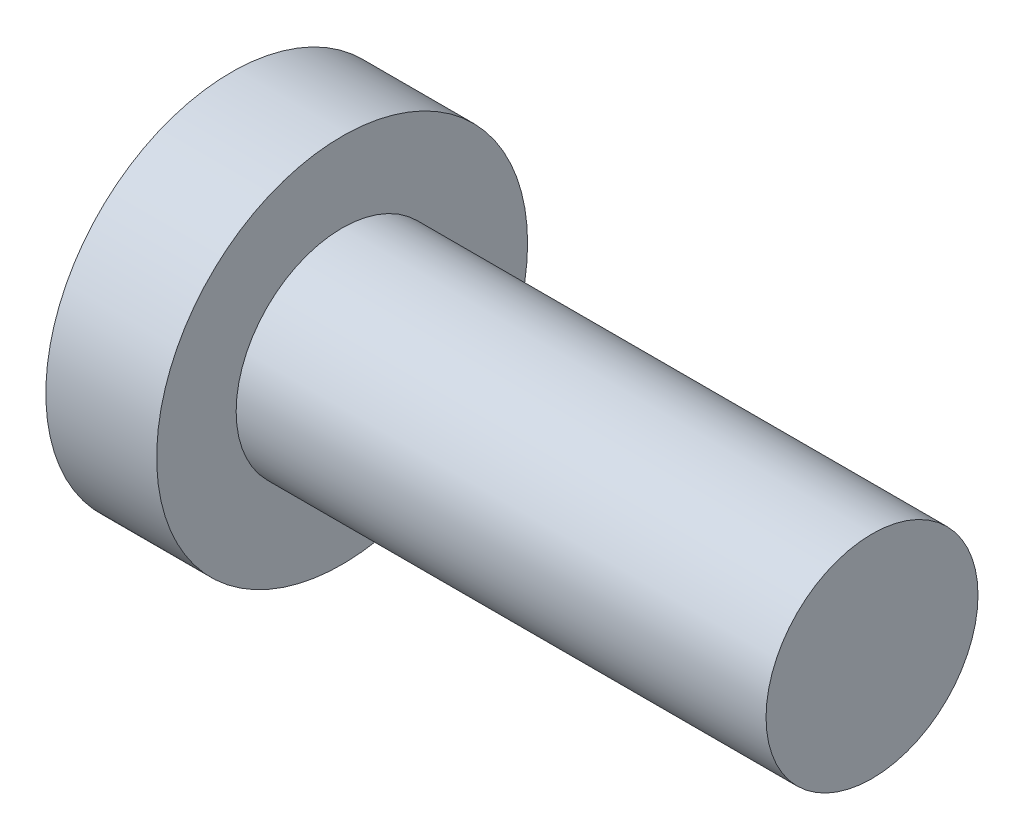
ISO-10303-21;
HEADER;
FILE_DESCRIPTION(('STEP AP214'),'2;1');
FILE_NAME('part.step','',(''),(''),'','','');
FILE_SCHEMA(('AUTOMOTIVE_DESIGN { 1 0 10303 214 1 1 1 1 }'));
ENDSEC;
DATA;
#1=APPLICATION_CONTEXT('core data for automotive mechanical design processes');
#2=APPLICATION_PROTOCOL_DEFINITION('international standard','automotive_design',2000,#1);
#3=PRODUCT_CONTEXT('',#1,'mechanical');
#4=PRODUCT('Part','Part','',(#3));
#5=PRODUCT_RELATED_PRODUCT_CATEGORY('part','',(#4));
#6=PRODUCT_DEFINITION_FORMATION('','',#4);
#7=PRODUCT_DEFINITION_CONTEXT('part definition',#1,'design');
#8=PRODUCT_DEFINITION('design','',#6,#7);
#9=PRODUCT_DEFINITION_SHAPE('','',#8);
#10=(LENGTH_UNIT() NAMED_UNIT(*) SI_UNIT(.MILLI.,.METRE.));
#11=(NAMED_UNIT(*) PLANE_ANGLE_UNIT() SI_UNIT($,.RADIAN.));
#12=(NAMED_UNIT(*) SI_UNIT($,.STERADIAN.) SOLID_ANGLE_UNIT());
#13=UNCERTAINTY_MEASURE_WITH_UNIT(LENGTH_MEASURE(1.E-05),#10,'distance_accuracy_value','');
#14=(GEOMETRIC_REPRESENTATION_CONTEXT(3) GLOBAL_UNCERTAINTY_ASSIGNED_CONTEXT((#13)) GLOBAL_UNIT_ASSIGNED_CONTEXT((#10,
#11,#12)) REPRESENTATION_CONTEXT('',''));
#15=CARTESIAN_POINT('',(0.,0.,0.));
#16=DIRECTION('',(0.,0.,1.));
#17=DIRECTION('',(1.,0.,0.));
#18=AXIS2_PLACEMENT_3D('',#15,#16,#17);
#19=CARTESIAN_POINT('',(1.01,0.22,0.22));
#20=DIRECTION('',(1.,0.,0.));
#21=DIRECTION('',(0.,0.,-1.));
#22=AXIS2_PLACEMENT_3D('',#19,#20,#21);
#23=PLANE('',#22);
#24=CARTESIAN_POINT('',(1.01,0.52,0.52));
#25=DIRECTION('',(-1.,0.,0.));
#26=DIRECTION('',(0.,0.,1.));
#27=AXIS2_PLACEMENT_3D('',#24,#25,#26);
#28=CIRCLE('',#27,0.3);
#29=CARTESIAN_POINT('',(1.01,0.516876228118476,0.220016263692126));
#30=VERTEX_POINT('',#29);
#31=CARTESIAN_POINT('',(1.01,0.220016263692126,0.516876228118476));
#32=VERTEX_POINT('',#31);
#33=EDGE_CURVE('E21',#30,#32,#28,.T.);
#34=ORIENTED_EDGE('',*,*,#33,.F.);
#35=DIRECTION('',(0.,0.,1.));
#36=VECTOR('',#35,1.);
#37=CARTESIAN_POINT('',(1.01,0.516876228118476,0.));
#38=LINE('',#37,#36);
#39=CARTESIAN_POINT('',(1.01,0.516876228118476,-0.220016263692126));
#40=VERTEX_POINT('',#39);
#41=EDGE_CURVE('E140',#40,#30,#38,.T.);
#42=ORIENTED_EDGE('',*,*,#41,.F.);
#43=CARTESIAN_POINT('',(1.01,0.52,-0.52));
#44=DIRECTION('',(-1.,0.,0.));
#45=DIRECTION('',(0.,0.,1.));
#46=AXIS2_PLACEMENT_3D('',#43,#44,#45);
#47=CIRCLE('',#46,0.3);
#48=CARTESIAN_POINT('',(1.01,0.220016263692126,-0.516876228118477));
#49=VERTEX_POINT('',#48);
#50=EDGE_CURVE('E221',#49,#40,#47,.T.);
#51=ORIENTED_EDGE('',*,*,#50,.F.);
#52=DIRECTION('',(0.,1.,0.));
#53=VECTOR('',#52,1.);
#54=CARTESIAN_POINT('',(1.01,0.,-0.516876228118477));
#55=LINE('',#54,#53);
#56=CARTESIAN_POINT('',(1.01,-0.220016263692126,-0.516876228118477));
#57=VERTEX_POINT('',#56);
#58=EDGE_CURVE('E161',#57,#49,#55,.T.);
#59=ORIENTED_EDGE('',*,*,#58,.F.);
#60=CARTESIAN_POINT('',(1.01,-0.52,-0.52));
#61=DIRECTION('',(-1.,0.,0.));
#62=DIRECTION('',(0.,0.,1.));
#63=AXIS2_PLACEMENT_3D('',#60,#61,#62);
#64=CIRCLE('',#63,0.3);
#65=CARTESIAN_POINT('',(1.01,-0.516876228118476,-0.220016263692126));
#66=VERTEX_POINT('',#65);
#67=EDGE_CURVE('E244',#66,#57,#64,.T.);
#68=ORIENTED_EDGE('',*,*,#67,.F.);
#69=DIRECTION('',(0.,0.,1.));
#70=VECTOR('',#69,1.);
#71=CARTESIAN_POINT('',(1.01,-0.516876228118476,0.));
#72=LINE('',#71,#70);
#73=CARTESIAN_POINT('',(1.01,-0.516876228118476,0.220016263692125));
#74=VERTEX_POINT('',#73);
#75=EDGE_CURVE('E250',#74,#66,#72,.F.);
#76=ORIENTED_EDGE('',*,*,#75,.F.);
#77=CARTESIAN_POINT('',(1.01,-0.52,0.52));
#78=DIRECTION('',(-1.,0.,0.));
#79=DIRECTION('',(0.,0.,1.));
#80=AXIS2_PLACEMENT_3D('',#77,#78,#79);
#81=CIRCLE('',#80,0.3);
#82=CARTESIAN_POINT('',(1.01,-0.220016263692126,0.516876228118476));
#83=VERTEX_POINT('',#82);
#84=EDGE_CURVE('E268',#83,#74,#81,.T.);
#85=ORIENTED_EDGE('',*,*,#84,.F.);
#86=DIRECTION('',(0.,1.,0.));
#87=VECTOR('',#86,1.);
#88=CARTESIAN_POINT('',(1.01,0.,0.516876228118476));
#89=LINE('',#88,#87);
#90=EDGE_CURVE('E274',#32,#83,#89,.F.);
#91=ORIENTED_EDGE('',*,*,#90,.F.);
#92=EDGE_LOOP('',(#34,#42,#51,#59,#68,#76,#85,#91));
#93=FACE_BOUND('',#92,.T.);
#94=ADVANCED_FACE('F18',(#93),#23,.F.);
#95=CARTESIAN_POINT('',(1.01,0.22,0.22));
#96=DIRECTION('',(0.,0.,-1.));
#97=DIRECTION('',(0.,1.,0.));
#98=AXIS2_PLACEMENT_3D('',#95,#96,#97);
#99=PLANE('',#98);
#100=DIRECTION('',(-1.,0.,0.));
#101=VECTOR('',#100,1.);
#102=CARTESIAN_POINT('',(1.01,0.52,0.22));
#103=LINE('',#102,#101);
#104=CARTESIAN_POINT('',(0.0355627454291621,0.52,0.22));
#105=VERTEX_POINT('',#104);
#106=CARTESIAN_POINT('',(1.00458946839209,0.519999999998763,0.220000000000004));
#107=VERTEX_POINT('',#106);
#108=EDGE_CURVE('E119',#105,#107,#103,.F.);
#109=ORIENTED_EDGE('',*,*,#108,.F.);
#110=CARTESIAN_POINT('',(0.124543344373249,1.02809486660112,0.22));
#111=CARTESIAN_POINT('',(0.104849922113076,0.944264082822282,0.22));
#112=CARTESIAN_POINT('',(0.087588161070983,0.860007452049439,0.22));
#113=CARTESIAN_POINT('',(0.0579279614229541,0.690642496515734,0.22));
#114=CARTESIAN_POINT('',(0.0455295228170185,0.605534171754872,0.22));
#115=CARTESIAN_POINT('',(0.0355627454291619,0.52,0.22));
#116=B_SPLINE_CURVE_WITH_KNOTS('',3,(#110,#111,#112,#113,#114,#115),.UNSPECIFIED.,.F.,.F.,(4,2,
4),(0.,0.258020026376229,0.516040052752457),.UNSPECIFIED.);
#117=CARTESIAN_POINT('',(0.124543344373167,1.02809486660077,0.22));
#118=VERTEX_POINT('',#117);
#119=EDGE_CURVE('E135',#118,#105,#116,.T.);
#120=ORIENTED_EDGE('',*,*,#119,.F.);
#121=DIRECTION('',(0.866025403784438,-0.500000000000001,0.));
#122=VECTOR('',#121,1.);
#123=CARTESIAN_POINT('',(0.,1.1,0.22));
#124=LINE('',#123,#122);
#125=EDGE_CURVE('E133',#107,#118,#124,.F.);
#126=ORIENTED_EDGE('',*,*,#125,.F.);
#127=EDGE_LOOP('',(#109,#120,#126));
#128=FACE_BOUND('',#127,.T.);
#129=ADVANCED_FACE('F134',(#128),#99,.T.);
#130=CARTESIAN_POINT('',(1.01,0.52,0.52));
#131=DIRECTION('',(-1.,0.,0.));
#132=DIRECTION('',(0.,0.,1.));
#133=AXIS2_PLACEMENT_3D('',#130,#131,#132);
#134=CYLINDRICAL_SURFACE('',#133,0.3);
#135=ORIENTED_EDGE('',*,*,#108,.T.);
#136=DIRECTION('',(-0.866022469392622,0.499998305828082,-0.00260320497714323));
#137=VECTOR('',#136,1.);
#138=CARTESIAN_POINT('',(1.01,0.516876228118476,0.220016263692126));
#139=LINE('',#138,#137);
#140=EDGE_CURVE('E123',#30,#107,#139,.T.);
#141=ORIENTED_EDGE('',*,*,#140,.F.);
#142=ORIENTED_EDGE('',*,*,#33,.T.);
#143=DIRECTION('',(0.866022469392615,0.00260320497712648,-0.499998305828094));
#144=VECTOR('',#143,1.);
#145=CARTESIAN_POINT('',(1.00458946838995,0.22,0.52));
#146=LINE('',#145,#144);
#147=CARTESIAN_POINT('',(1.00458946836315,0.219999999999939,0.520000000015471));
#148=VERTEX_POINT('',#147);
#149=EDGE_CURVE('E280',#148,#32,#146,.T.);
#150=ORIENTED_EDGE('',*,*,#149,.F.);
#151=DIRECTION('',(1.,0.,0.));
#152=VECTOR('',#151,1.);
#153=CARTESIAN_POINT('',(1.01,0.22,0.52));
#154=LINE('',#153,#152);
#155=CARTESIAN_POINT('',(0.0355627454291622,0.22,0.52));
#156=VERTEX_POINT('',#155);
#157=EDGE_CURVE('E130',#156,#148,#154,.T.);
#158=ORIENTED_EDGE('',*,*,#157,.F.);
#159=CARTESIAN_POINT('',(0.0355627454291619,0.52,0.22));
#160=CARTESIAN_POINT('',(0.0336144724237012,0.503287720511368,0.219985328370494));
#161=CARTESIAN_POINT('',(0.0318313107592915,0.486557176445317,0.221395774015768));
#162=CARTESIAN_POINT('',(0.0286392637046213,0.45353437167121,0.226980778799422));
#163=CARTESIAN_POINT('',(0.0272302228990259,0.437241931504151,0.231154187637122));
#164=CARTESIAN_POINT('',(0.0248278492627614,0.405543209834353,0.242183390271547));
#165=CARTESIAN_POINT('',(0.023834838749939,0.390137623358916,0.249041255913871));
#166=CARTESIAN_POINT('',(0.0222954705714954,0.36067866272415,0.265247055283416));
#167=CARTESIAN_POINT('',(0.0217489713274229,0.346624861192877,0.274594198470578));
#168=CARTESIAN_POINT('',(0.0211210003816236,0.320369345983066,0.295441236792413));
#169=CARTESIAN_POINT('',(0.0210362310499093,0.308155106097585,0.306925258793494));
#170=CARTESIAN_POINT('',(0.0213253868856954,0.285809210047338,0.331761685438082));
#171=CARTESIAN_POINT('',(0.0216993026507305,0.27567751119808,0.345114051777918));
#172=CARTESIAN_POINT('',(0.0228926461672017,0.257809524910824,0.373257872138579));
#173=CARTESIAN_POINT('',(0.0237107084031614,0.250066008909201,0.388044801778144));
#174=CARTESIAN_POINT('',(0.0257675907829931,0.237142871439603,0.418670011750901));
#175=CARTESIAN_POINT('',(0.0270062517189219,0.231962281655374,0.434507892448339));
#176=CARTESIAN_POINT('',(0.0294449242960518,0.225424263226575,0.462016435468613));
#177=CARTESIAN_POINT('',(0.0305487725472808,0.223390097819393,0.473539851773626));
#178=CARTESIAN_POINT('',(0.0329296678559742,0.220677851109225,0.496710667987145));
#179=CARTESIAN_POINT('',(0.0342064645840768,0.219997831719864,0.508357866680795));
#180=CARTESIAN_POINT('',(0.0355627454291623,0.22,0.52));
#181=B_SPLINE_CURVE_WITH_KNOTS('',3,(#159,#160,#161,#162,#163,#164,#165,#166,#167,#168,#169,
#170,#171,#172,#173,#174,#175,#176,#177,#178,#179,#180),.UNSPECIFIED.,.F.,.F.,(4,2,2,2,2,2,2,2,
2,2,4),(0.,0.0504152737466318,0.100809571359595,0.151242839880603,0.201660110959704,
0.251716830020686,0.301772522999282,0.351675185552514,0.401558979621452,0.436743606856448,
0.471877840708902),.UNSPECIFIED.);
#182=EDGE_CURVE('E126',#105,#156,#181,.T.);
#183=ORIENTED_EDGE('',*,*,#182,.F.);
#184=EDGE_LOOP('',(#135,#141,#142,#150,#158,#183));
#185=FACE_BOUND('',#184,.T.);
#186=ADVANCED_FACE('F121',(#185),#134,.T.);
#187=CARTESIAN_POINT('',(1.01,0.22,0.22));
#188=DIRECTION('',(0.,-1.,0.));
#189=DIRECTION('',(0.,0.,-1.));
#190=AXIS2_PLACEMENT_3D('',#187,#188,#189);
#191=PLANE('',#190);
#192=ORIENTED_EDGE('',*,*,#157,.T.);
#193=DIRECTION('',(-0.866025403784438,0.,0.500000000000001));
#194=VECTOR('',#193,1.);
#195=CARTESIAN_POINT('',(0.,0.22,1.1));
#196=LINE('',#195,#194);
#197=CARTESIAN_POINT('',(0.124543344373086,0.22,1.02809486660042));
#198=VERTEX_POINT('',#197);
#199=EDGE_CURVE('E277',#198,#148,#196,.F.);
#200=ORIENTED_EDGE('',*,*,#199,.F.);
#201=CARTESIAN_POINT('',(4.5,0.22,0.));
#202=DIRECTION('',(0.,1.,0.));
#203=DIRECTION('',(0.,0.,1.));
#204=AXIS2_PLACEMENT_3D('',#201,#202,#203);
#205=CIRCLE('',#204,4.49461900498808);
#206=EDGE_CURVE('E293',#156,#198,#205,.T.);
#207=ORIENTED_EDGE('',*,*,#206,.F.);
#208=EDGE_LOOP('',(#192,#200,#207));
#209=FACE_BOUND('',#208,.T.);
#210=ADVANCED_FACE('F290',(#209),#191,.T.);
#211=CARTESIAN_POINT('',(0.,0.,1.1));
#212=DIRECTION('',(-0.500000000000001,0.,-0.866025403784438));
#213=DIRECTION('',(-0.866025403784438,0.,0.500000000000001));
#214=AXIS2_PLACEMENT_3D('',#211,#212,#213);
#215=PLANE('',#214);
#216=DIRECTION('',(0.866025403784438,0.,-0.500000000000001));
#217=VECTOR('',#216,1.);
#218=CARTESIAN_POINT('',(0.124543344373086,-0.22,1.02809486660042));
#219=LINE('',#218,#217);
#220=CARTESIAN_POINT('',(0.124543344373086,-0.220000000000001,1.02809486660042));
#221=VERTEX_POINT('',#220);
#222=CARTESIAN_POINT('',(1.00458946838995,-0.22,0.52));
#223=VERTEX_POINT('',#222);
#224=EDGE_CURVE('E271',#221,#223,#219,.T.);
#225=ORIENTED_EDGE('',*,*,#224,.F.);
#226=CARTESIAN_POINT('',(0.124543344373086,0.22,1.02809486660042));
#227=CARTESIAN_POINT('',(0.121298684225372,0.146666666666667,1.02996817201013));
#228=CARTESIAN_POINT('',(0.119676354151515,0.0733333333333333,1.03090482471499));
#229=CARTESIAN_POINT('',(0.119676354151515,-0.0733333333333337,1.03090482471499));
#230=CARTESIAN_POINT('',(0.121298684225372,-0.146666666666667,1.02996817201013));
#231=CARTESIAN_POINT('',(0.124543344373086,-0.220000000000001,1.02809486660042));
#232=B_SPLINE_CURVE_WITH_KNOTS('',3,(#226,#227,#228,#229,#230,#231),.UNSPECIFIED.,.F.,.F.,(4,2,
4),(0.,0.220071768881024,0.440143537762047),.UNSPECIFIED.);
#233=EDGE_CURVE('E300',#198,#221,#232,.T.);
#234=ORIENTED_EDGE('',*,*,#233,.F.);
#235=ORIENTED_EDGE('',*,*,#199,.T.);
#236=ORIENTED_EDGE('',*,*,#149,.T.);
#237=ORIENTED_EDGE('',*,*,#90,.T.);
#238=CARTESIAN_POINT('',(1.00458946838995,-0.22,0.52));
#239=CARTESIAN_POINT('',(1.00481490720703,-0.219999999999949,0.519869840486178));
#240=CARTESIAN_POINT('',(1.00504034602412,-0.220000084707494,0.519739680972357));
#241=CARTESIAN_POINT('',(1.00549122365829,-0.220000423537406,0.519479362165225));
#242=CARTESIAN_POINT('',(1.00571666247537,-0.220000677659774,0.519349202871913));
#243=CARTESIAN_POINT('',(1.00616754010955,-0.220001355318963,0.519088884726309));
#244=CARTESIAN_POINT('',(1.00639297892663,-0.220001778855784,0.518958725874017));
#245=CARTESIAN_POINT('',(1.0068438565608,-0.220002795343145,0.51869840883096));
#246=CARTESIAN_POINT('',(1.00706929537789,-0.220003388293685,0.518568250640195));
#247=CARTESIAN_POINT('',(1.00752017301206,-0.220004743607485,0.5183079351407));
#248=CARTESIAN_POINT('',(1.00774561182914,-0.220005505970745,0.51817777783197));
#249=CARTESIAN_POINT('',(1.00819648946332,-0.220007200108688,0.517917464317052));
#250=CARTESIAN_POINT('',(1.0084219282804,-0.220008131883371,0.517787308110863));
#251=CARTESIAN_POINT('',(1.00887280591457,-0.220010164842598,0.517526997021531));
#252=CARTESIAN_POINT('',(1.00909824473166,-0.220011266027142,0.517396842138387));
#253=CARTESIAN_POINT('',(1.00954912236583,-0.220013637804165,0.517136533915647));
#254=CARTESIAN_POINT('',(1.00977456118291,-0.220014908396643,0.517006380576049));
#255=CARTESIAN_POINT('',(1.01,-0.220016263692126,0.516876228118476));
#256=B_SPLINE_CURVE_WITH_KNOTS('',3,(#238,#239,#240,#241,#242,#243,#244,#245,#246,#247,#248,
#249,#250,#251,#252,#253,#254,#255),.UNSPECIFIED.,.F.,.F.,(4,2,2,2,2,2,2,2,4),(0.,
0.00078094648475928,0.00156189296951852,0.00234283945427775,0.003123785939037,
0.00390473242379628,0.0046856789085555,0.00546662539331475,0.00624757187807402),.UNSPECIFIED.);
#257=EDGE_CURVE('E262',#223,#83,#256,.T.);
#258=ORIENTED_EDGE('',*,*,#257,.F.);
#259=EDGE_LOOP('',(#225,#234,#235,#236,#237,#258));
#260=FACE_BOUND('',#259,.T.);
#261=ADVANCED_FACE('F298',(#260),#215,.T.);
#262=CARTESIAN_POINT('',(1.01,-0.22,0.22));
#263=DIRECTION('',(0.,1.,0.));
#264=DIRECTION('',(0.,0.,1.));
#265=AXIS2_PLACEMENT_3D('',#262,#263,#264);
#266=PLANE('',#265);
#267=DIRECTION('',(-1.,0.,0.));
#268=VECTOR('',#267,1.);
#269=CARTESIAN_POINT('',(1.01,-0.22,0.52));
#270=LINE('',#269,#268);
#271=CARTESIAN_POINT('',(0.0355627454291623,-0.220000000000001,0.52));
#272=VERTEX_POINT('',#271);
#273=EDGE_CURVE('E265',#272,#223,#270,.F.);
#274=ORIENTED_EDGE('',*,*,#273,.F.);
#275=CARTESIAN_POINT('',(4.5,-0.220000000000001,0.));
#276=DIRECTION('',(0.,1.,0.));
#277=DIRECTION('',(0.,0.,1.));
#278=AXIS2_PLACEMENT_3D('',#275,#276,#277);
#279=CIRCLE('',#278,4.49461900498808);
#280=EDGE_CURVE('E304',#221,#272,#279,.F.);
#281=ORIENTED_EDGE('',*,*,#280,.F.);
#282=ORIENTED_EDGE('',*,*,#224,.T.);
#283=EDGE_LOOP('',(#274,#281,#282));
#284=FACE_BOUND('',#283,.T.);
#285=ADVANCED_FACE('F413',(#284),#266,.T.);
#286=CARTESIAN_POINT('',(1.01,-0.52,0.52));
#287=DIRECTION('',(-1.,0.,0.));
#288=DIRECTION('',(0.,0.,1.));
#289=AXIS2_PLACEMENT_3D('',#286,#287,#288);
#290=CYLINDRICAL_SURFACE('',#289,0.3);
#291=ORIENTED_EDGE('',*,*,#273,.T.);
#292=ORIENTED_EDGE('',*,*,#257,.T.);
#293=ORIENTED_EDGE('',*,*,#84,.T.);
#294=DIRECTION('',(0.866022469392616,0.499998305828093,0.00260320497712575));
#295=VECTOR('',#294,1.);
#296=CARTESIAN_POINT('',(1.00458946838994,-0.52,0.22));
#297=LINE('',#296,#295);
#298=CARTESIAN_POINT('',(1.00458946836352,-0.520000000015254,0.21999999999994));
#299=VERTEX_POINT('',#298);
#300=EDGE_CURVE('E256',#299,#74,#297,.T.);
#301=ORIENTED_EDGE('',*,*,#300,.F.);
#302=DIRECTION('',(1.,0.,0.));
#303=VECTOR('',#302,1.);
#304=CARTESIAN_POINT('',(1.01,-0.52,0.22));
#305=LINE('',#304,#303);
#306=CARTESIAN_POINT('',(0.0355627454291621,-0.52,0.22));
#307=VERTEX_POINT('',#306);
#308=EDGE_CURVE('E257',#307,#299,#305,.T.);
#309=ORIENTED_EDGE('',*,*,#308,.F.);
#310=CARTESIAN_POINT('',(0.0355627454291623,-0.220000000000001,0.52));
#311=CARTESIAN_POINT('',(0.0336144724237012,-0.219985328370494,0.503287720511368));
#312=CARTESIAN_POINT('',(0.0318313107592915,-0.221395774015768,0.486557176445317));
#313=CARTESIAN_POINT('',(0.0286392637046214,-0.226980778799423,0.453534371671211));
#314=CARTESIAN_POINT('',(0.0272302228990262,-0.231154187637122,0.437241931504153));
#315=CARTESIAN_POINT('',(0.0248278492627622,-0.242183390271547,0.405543209834355));
#316=CARTESIAN_POINT('',(0.0238348387499401,-0.249041255913871,0.390137623358918));
#317=CARTESIAN_POINT('',(0.022295470571496,-0.265247055283415,0.360678662724152));
#318=CARTESIAN_POINT('',(0.0217489713274227,-0.274594198470577,0.346624861192879));
#319=CARTESIAN_POINT('',(0.0211210003816225,-0.295441236792411,0.320369345983068));
#320=CARTESIAN_POINT('',(0.0210362310499081,-0.306925258793492,0.308155106097588));
#321=CARTESIAN_POINT('',(0.0213253868856949,-0.33176168543808,0.28580921004734));
#322=CARTESIAN_POINT('',(0.0216993026507309,-0.345114051777916,0.275677511198083));
#323=CARTESIAN_POINT('',(0.022892646167202,-0.373257872138576,0.257809524910826));
#324=CARTESIAN_POINT('',(0.0237107084031607,-0.388044801778141,0.250066008909202));
#325=CARTESIAN_POINT('',(0.025767590782992,-0.418670011750899,0.237142871439604));
#326=CARTESIAN_POINT('',(0.0270062517189215,-0.434507892448336,0.231962281655375));
#327=CARTESIAN_POINT('',(0.0294449242960514,-0.462016435468611,0.225424263226576));
#328=CARTESIAN_POINT('',(0.0305487725472801,-0.473539851773625,0.223390097819393));
#329=CARTESIAN_POINT('',(0.0329296678559732,-0.496710667987144,0.220677851109225));
#330=CARTESIAN_POINT('',(0.0342064645840757,-0.508357866680795,0.219997831719863));
#331=CARTESIAN_POINT('',(0.0355627454291619,-0.52,0.22));
#332=B_SPLINE_CURVE_WITH_KNOTS('',3,(#310,#311,#312,#313,#314,#315,#316,#317,#318,#319,#320,
#321,#322,#323,#324,#325,#326,#327,#328,#329,#330,#331),.UNSPECIFIED.,.F.,.F.,(4,2,2,2,2,2,2,2,
2,2,4),(0.,0.0504152737466306,0.100809571359593,0.1512428398806,0.2016601109597,
0.251716830020682,0.301772522999278,0.35167518555251,0.401558979621449,0.436743606856446,
0.471877840708902),.UNSPECIFIED.);
#333=EDGE_CURVE('E418',#272,#307,#332,.T.);
#334=ORIENTED_EDGE('',*,*,#333,.F.);
#335=EDGE_LOOP('',(#291,#292,#293,#301,#309,#334));
#336=FACE_BOUND('',#335,.T.);
#337=ADVANCED_FACE('F384',(#336),#290,.T.);
#338=CARTESIAN_POINT('',(1.01,-0.22,0.22));
#339=DIRECTION('',(0.,0.,-1.));
#340=DIRECTION('',(0.,1.,0.));
#341=AXIS2_PLACEMENT_3D('',#338,#339,#340);
#342=PLANE('',#341);
#343=ORIENTED_EDGE('',*,*,#308,.T.);
#344=DIRECTION('',(-0.866025403784438,-0.500000000000001,0.));
#345=VECTOR('',#344,1.);
#346=CARTESIAN_POINT('',(0.,-1.1,0.22));
#347=LINE('',#346,#345);
#348=CARTESIAN_POINT('',(0.124543344363401,-1.02809486660601,0.219999999781252));
#349=VERTEX_POINT('',#348);
#350=EDGE_CURVE('E253',#349,#299,#347,.F.);
#351=ORIENTED_EDGE('',*,*,#350,.F.);
#352=CARTESIAN_POINT('',(0.0355627454291619,-0.52,0.22));
#353=CARTESIAN_POINT('',(0.0455295228170186,-0.605534171754872,0.22));
#354=CARTESIAN_POINT('',(0.0579279614229541,-0.690642496515734,0.22));
#355=CARTESIAN_POINT('',(0.087588161070983,-0.860007452049439,0.22));
#356=CARTESIAN_POINT('',(0.104849922113076,-0.944264082822282,0.22));
#357=CARTESIAN_POINT('',(0.124543344373249,-1.02809486660112,0.22));
#358=B_SPLINE_CURVE_WITH_KNOTS('',3,(#352,#353,#354,#355,#356,#357),.UNSPECIFIED.,.F.,.F.,(4,2,
4),(0.,0.258020026376229,0.516040052752458),.UNSPECIFIED.);
#359=EDGE_CURVE('E425',#307,#349,#358,.T.);
#360=ORIENTED_EDGE('',*,*,#359,.F.);
#361=EDGE_LOOP('',(#343,#351,#360));
#362=FACE_BOUND('',#361,.T.);
#363=ADVANCED_FACE('F412',(#362),#342,.T.);
#364=CARTESIAN_POINT('',(0.,-1.1,0.));
#365=DIRECTION('',(-0.500000000000001,0.866025403784438,0.));
#366=DIRECTION('',(-0.866025403784438,-0.500000000000001,0.));
#367=AXIS2_PLACEMENT_3D('',#364,#365,#366);
#368=PLANE('',#367);
#369=CARTESIAN_POINT('',(0.124543344353716,-1.02809486661161,0.219999999562505));
#370=CARTESIAN_POINT('',(0.121298684218916,-1.02996817201386,0.146666666375003));
#371=CARTESIAN_POINT('',(0.119676354151515,-1.03090482471499,0.0733333331875016));
#372=CARTESIAN_POINT('',(0.119676354151515,-1.03090482471499,-0.0733333331875025));
#373=CARTESIAN_POINT('',(0.121298684218916,-1.02996817201386,-0.146666666375005));
#374=CARTESIAN_POINT('',(0.124543344353717,-1.02809486661161,-0.219999999562508));
#375=B_SPLINE_CURVE_WITH_KNOTS('',3,(#369,#370,#371,#372,#373,#374),.UNSPECIFIED.,.F.,.F.,(4,2,
4),(0.,0.220071768443099,0.440143536886202),.UNSPECIFIED.);
#376=CARTESIAN_POINT('',(0.124543344373167,-1.02809486660077,-0.220000000000002));
#377=VERTEX_POINT('',#376);
#378=EDGE_CURVE('E436',#349,#377,#375,.T.);
#379=ORIENTED_EDGE('',*,*,#378,.F.);
#380=ORIENTED_EDGE('',*,*,#350,.T.);
#381=ORIENTED_EDGE('',*,*,#300,.T.);
#382=ORIENTED_EDGE('',*,*,#75,.T.);
#383=CARTESIAN_POINT('',(1.00458946838995,-0.52,-0.22));
#384=CARTESIAN_POINT('',(1.00481490720703,-0.519869840486179,-0.219999999999949));
#385=CARTESIAN_POINT('',(1.00504034602412,-0.519739680972358,-0.220000084707494));
#386=CARTESIAN_POINT('',(1.00549122365829,-0.519479362165225,-0.220000423537406));
#387=CARTESIAN_POINT('',(1.00571666247537,-0.519349202871914,-0.220000677659774));
#388=CARTESIAN_POINT('',(1.00616754010954,-0.519088884726309,-0.220001355318963));
#389=CARTESIAN_POINT('',(1.00639297892663,-0.518958725874017,-0.220001778855784));
#390=CARTESIAN_POINT('',(1.0068438565608,-0.51869840883096,-0.220002795343145));
#391=CARTESIAN_POINT('',(1.00706929537789,-0.518568250640195,-0.220003388293685));
#392=CARTESIAN_POINT('',(1.00752017301206,-0.5183079351407,-0.220004743607485));
#393=CARTESIAN_POINT('',(1.00774561182914,-0.51817777783197,-0.220005505970745));
#394=CARTESIAN_POINT('',(1.00819648946332,-0.517917464317052,-0.220007200108688));
#395=CARTESIAN_POINT('',(1.0084219282804,-0.517787308110863,-0.220008131883371));
#396=CARTESIAN_POINT('',(1.00887280591457,-0.51752699702153,-0.220010164842598));
#397=CARTESIAN_POINT('',(1.00909824473166,-0.517396842138387,-0.220011266027142));
#398=CARTESIAN_POINT('',(1.00954912236583,-0.517136533915646,-0.220013637804165));
#399=CARTESIAN_POINT('',(1.00977456118291,-0.517006380576049,-0.220014908396643));
#400=CARTESIAN_POINT('',(1.01,-0.516876228118476,-0.220016263692126));
#401=B_SPLINE_CURVE_WITH_KNOTS('',3,(#383,#384,#385,#386,#387,#388,#389,#390,#391,#392,#393,
#394,#395,#396,#397,#398,#399,#400),.UNSPECIFIED.,.F.,.F.,(4,2,2,2,2,2,2,2,4),(0.,
0.000780946484759468,0.001561892969519,0.00234283945427829,0.00312378593903779,
0.00390473242379724,0.00468567890855653,0.00546662539331601,0.00624757187807553),.UNSPECIFIED.);
#402=CARTESIAN_POINT('',(1.00458946838995,-0.52,-0.22));
#403=VERTEX_POINT('',#402);
#404=EDGE_CURVE('E238',#403,#66,#401,.T.);
#405=ORIENTED_EDGE('',*,*,#404,.F.);
#406=DIRECTION('',(0.866025403784438,0.500000000000001,0.));
#407=VECTOR('',#406,1.);
#408=CARTESIAN_POINT('',(0.124543344373086,-1.02809486660042,-0.22));
#409=LINE('',#408,#407);
#410=EDGE_CURVE('E247',#377,#403,#409,.T.);
#411=ORIENTED_EDGE('',*,*,#410,.F.);
#412=EDGE_LOOP('',(#379,#380,#381,#382,#405,#411));
#413=FACE_BOUND('',#412,.T.);
#414=ADVANCED_FACE('F391',(#413),#368,.T.);
#415=CARTESIAN_POINT('',(1.01,-0.22,-0.22));
#416=DIRECTION('',(0.,0.,1.));
#417=DIRECTION('',(0.,-1.,0.));
#418=AXIS2_PLACEMENT_3D('',#415,#416,#417);
#419=PLANE('',#418);
#420=DIRECTION('',(-1.,0.,0.));
#421=VECTOR('',#420,1.);
#422=CARTESIAN_POINT('',(1.01,-0.52,-0.22));
#423=LINE('',#422,#421);
#424=CARTESIAN_POINT('',(0.0355627454291621,-0.52,-0.219999999999999));
#425=VERTEX_POINT('',#424);
#426=EDGE_CURVE('E241',#425,#403,#423,.F.);
#427=ORIENTED_EDGE('',*,*,#426,.F.);
#428=CARTESIAN_POINT('',(0.124543344373249,-1.02809486660112,-0.220000000000003));
#429=CARTESIAN_POINT('',(0.104849922113076,-0.944264082822282,-0.220000000000002));
#430=CARTESIAN_POINT('',(0.087588161070983,-0.860007452049439,-0.220000000000001));
#431=CARTESIAN_POINT('',(0.0579279614229541,-0.690642496515734,-0.219999999999999));
#432=CARTESIAN_POINT('',(0.0455295228170186,-0.605534171754872,-0.219999999999999));
#433=CARTESIAN_POINT('',(0.0355627454291619,-0.52,-0.219999999999998));
#434=B_SPLINE_CURVE_WITH_KNOTS('',3,(#428,#429,#430,#431,#432,#433),.UNSPECIFIED.,.F.,.F.,(4,2,
4),(0.,0.258020026376229,0.516040052752458),.UNSPECIFIED.);
#435=EDGE_CURVE('E437',#377,#425,#434,.T.);
#436=ORIENTED_EDGE('',*,*,#435,.F.);
#437=ORIENTED_EDGE('',*,*,#410,.T.);
#438=EDGE_LOOP('',(#427,#436,#437));
#439=FACE_BOUND('',#438,.T.);
#440=ADVANCED_FACE('F453',(#439),#419,.T.);
#441=CARTESIAN_POINT('',(1.01,-0.52,-0.52));
#442=DIRECTION('',(-1.,0.,0.));
#443=DIRECTION('',(0.,0.,1.));
#444=AXIS2_PLACEMENT_3D('',#441,#442,#443);
#445=CYLINDRICAL_SURFACE('',#444,0.3);
#446=ORIENTED_EDGE('',*,*,#426,.T.);
#447=ORIENTED_EDGE('',*,*,#404,.T.);
#448=ORIENTED_EDGE('',*,*,#67,.T.);
#449=DIRECTION('',(0.866022469392615,-0.0026032049771395,0.499998305828094));
#450=VECTOR('',#449,1.);
#451=CARTESIAN_POINT('',(1.00458946838995,-0.22,-0.52));
#452=LINE('',#451,#450);
#453=CARTESIAN_POINT('',(1.00458946835645,-0.219999999999925,-0.520000000019338));
#454=VERTEX_POINT('',#453);
#455=EDGE_CURVE('E232',#454,#57,#452,.T.);
#456=ORIENTED_EDGE('',*,*,#455,.F.);
#457=DIRECTION('',(1.,0.,0.));
#458=VECTOR('',#457,1.);
#459=CARTESIAN_POINT('',(1.01,-0.22,-0.52));
#460=LINE('',#459,#458);
#461=CARTESIAN_POINT('',(0.0355627454291622,-0.22,-0.52));
#462=VERTEX_POINT('',#461);
#463=EDGE_CURVE('E233',#462,#454,#460,.T.);
#464=ORIENTED_EDGE('',*,*,#463,.F.);
#465=CARTESIAN_POINT('',(0.0355627454291619,-0.52,-0.219999999999998));
#466=CARTESIAN_POINT('',(0.0336144724237011,-0.503287720511368,-0.219985328370493));
#467=CARTESIAN_POINT('',(0.0318313107592914,-0.486557176445317,-0.221395774015768));
#468=CARTESIAN_POINT('',(0.0286392637046214,-0.453534371671211,-0.226980778799423));
#469=CARTESIAN_POINT('',(0.0272302228990262,-0.437241931504152,-0.231154187637122));
#470=CARTESIAN_POINT('',(0.0248278492627621,-0.405543209834354,-0.242183390271547));
#471=CARTESIAN_POINT('',(0.02383483874994,-0.390137623358916,-0.249041255913871));
#472=CARTESIAN_POINT('',(0.0222954705714962,-0.36067866272415,-0.265247055283416));
#473=CARTESIAN_POINT('',(0.0217489713274231,-0.346624861192877,-0.274594198470579));
#474=CARTESIAN_POINT('',(0.0211210003816234,-0.320369345983066,-0.295441236792414));
#475=CARTESIAN_POINT('',(0.0210362310499093,-0.308155106097585,-0.306925258793495));
#476=CARTESIAN_POINT('',(0.0213253868856955,-0.285809210047338,-0.331761685438082));
#477=CARTESIAN_POINT('',(0.0216993026507305,-0.275677511198081,-0.345114051777918));
#478=CARTESIAN_POINT('',(0.0228926461672017,-0.257809524910825,-0.373257872138578));
#479=CARTESIAN_POINT('',(0.0237107084031614,-0.250066008909202,-0.388044801778144));
#480=CARTESIAN_POINT('',(0.0257675907829931,-0.237142871439604,-0.4186700117509));
#481=CARTESIAN_POINT('',(0.0270062517189219,-0.231962281655375,-0.434507892448337));
#482=CARTESIAN_POINT('',(0.0294449242960518,-0.225424263226575,-0.462016435468612));
#483=CARTESIAN_POINT('',(0.0305487725472808,-0.223390097819393,-0.473539851773625));
#484=CARTESIAN_POINT('',(0.0329296678559742,-0.220677851109225,-0.496710667987144));
#485=CARTESIAN_POINT('',(0.0342064645840767,-0.219997831719864,-0.508357866680795));
#486=CARTESIAN_POINT('',(0.0355627454291623,-0.22,-0.52));
#487=B_SPLINE_CURVE_WITH_KNOTS('',3,(#465,#466,#467,#468,#469,#470,#471,#472,#473,#474,#475,
#476,#477,#478,#479,#480,#481,#482,#483,#484,#485,#486),.UNSPECIFIED.,.F.,.F.,(4,2,2,2,2,2,2,2,
2,2,4),(0.,0.0504152737466312,0.100809571359594,0.151242839880602,0.201660110959703,
0.251716830020685,0.301772522999281,0.351675185552512,0.401558979621449,0.436743606856446,
0.471877840708902),.UNSPECIFIED.);
#488=EDGE_CURVE('E439',#425,#462,#487,.T.);
#489=ORIENTED_EDGE('',*,*,#488,.F.);
#490=EDGE_LOOP('',(#446,#447,#448,#456,#464,#489));
#491=FACE_BOUND('',#490,.T.);
#492=ADVANCED_FACE('F457',(#491),#445,.T.);
#493=CARTESIAN_POINT('',(1.01,-0.22,-0.22));
#494=DIRECTION('',(0.,1.,0.));
#495=DIRECTION('',(0.,0.,1.));
#496=AXIS2_PLACEMENT_3D('',#493,#494,#495);
#497=PLANE('',#496);
#498=ORIENTED_EDGE('',*,*,#463,.T.);
#499=DIRECTION('',(0.866025403784438,0.,0.500000000000001));
#500=VECTOR('',#499,1.);
#501=CARTESIAN_POINT('',(0.,-0.22,-1.1));
#502=LINE('',#501,#500);
#503=CARTESIAN_POINT('',(0.124543344373087,-0.22,-1.02809486660042));
#504=VERTEX_POINT('',#503);
#505=EDGE_CURVE('E229',#504,#454,#502,.T.);
#506=ORIENTED_EDGE('',*,*,#505,.F.);
#507=CARTESIAN_POINT('',(4.5,-0.22,0.));
#508=DIRECTION('',(0.,1.,0.));
#509=DIRECTION('',(0.,0.,1.));
#510=AXIS2_PLACEMENT_3D('',#507,#508,#509);
#511=CIRCLE('',#510,4.49461900498808);
#512=EDGE_CURVE('E474',#462,#504,#511,.F.);
#513=ORIENTED_EDGE('',*,*,#512,.F.);
#514=EDGE_LOOP('',(#498,#506,#513));
#515=FACE_BOUND('',#514,.T.);
#516=ADVANCED_FACE('F462',(#515),#497,.T.);
#517=CARTESIAN_POINT('',(0.,0.,-1.1));
#518=DIRECTION('',(-0.500000000000001,0.,0.866025403784438));
#519=DIRECTION('',(0.866025403784438,0.,0.500000000000001));
#520=AXIS2_PLACEMENT_3D('',#517,#518,#519);
#521=PLANE('',#520);
#522=DIRECTION('',(0.866025403784438,0.,0.500000000000001));
#523=VECTOR('',#522,1.);
#524=CARTESIAN_POINT('',(0.124543344373086,0.22,-1.02809486660042));
#525=LINE('',#524,#523);
#526=CARTESIAN_POINT('',(0.124543344373086,0.22,-1.02809486660042));
#527=VERTEX_POINT('',#526);
#528=CARTESIAN_POINT('',(1.00458946838995,0.22,-0.52));
#529=VERTEX_POINT('',#528);
#530=EDGE_CURVE('E224',#527,#529,#525,.T.);
#531=ORIENTED_EDGE('',*,*,#530,.F.);
#532=CARTESIAN_POINT('',(0.124543344373087,-0.22,-1.02809486660042));
#533=CARTESIAN_POINT('',(0.121298684225372,-0.146666666666666,-1.02996817201014));
#534=CARTESIAN_POINT('',(0.119676354151515,-0.073333333333333,-1.03090482471499));
#535=CARTESIAN_POINT('',(0.119676354151515,0.0733333333333336,-1.03090482471499));
#536=CARTESIAN_POINT('',(0.121298684225372,0.146666666666667,-1.02996817201013));
#537=CARTESIAN_POINT('',(0.124543344373087,0.22,-1.02809486660042));
#538=B_SPLINE_CURVE_WITH_KNOTS('',3,(#532,#533,#534,#535,#536,#537),.UNSPECIFIED.,.F.,.F.,(4,2,
4),(0.,0.220071768881023,0.440143537762046),.UNSPECIFIED.);
#539=EDGE_CURVE('E476',#504,#527,#538,.T.);
#540=ORIENTED_EDGE('',*,*,#539,.F.);
#541=ORIENTED_EDGE('',*,*,#505,.T.);
#542=ORIENTED_EDGE('',*,*,#455,.T.);
#543=ORIENTED_EDGE('',*,*,#58,.T.);
#544=CARTESIAN_POINT('',(1.00458946838995,0.22,-0.52));
#545=CARTESIAN_POINT('',(1.00481490720703,0.219999999999949,-0.519869840486179));
#546=CARTESIAN_POINT('',(1.00504034602412,0.220000084707493,-0.519739680972358));
#547=CARTESIAN_POINT('',(1.00549122365829,0.220000423537406,-0.519479362165225));
#548=CARTESIAN_POINT('',(1.00571666247537,0.220000677659774,-0.519349202871914));
#549=CARTESIAN_POINT('',(1.00616754010955,0.220001355318963,-0.51908888472631));
#550=CARTESIAN_POINT('',(1.00639297892663,0.220001778855784,-0.518958725874017));
#551=CARTESIAN_POINT('',(1.0068438565608,0.220002795343145,-0.51869840883096));
#552=CARTESIAN_POINT('',(1.00706929537789,0.220003388293685,-0.518568250640195));
#553=CARTESIAN_POINT('',(1.00752017301206,0.220004743607485,-0.518307935140701));
#554=CARTESIAN_POINT('',(1.00774561182914,0.220005505970745,-0.518177777831971));
#555=CARTESIAN_POINT('',(1.00819648946332,0.220007200108688,-0.517917464317052));
#556=CARTESIAN_POINT('',(1.0084219282804,0.220008131883371,-0.517787308110863));
#557=CARTESIAN_POINT('',(1.00887280591457,0.220010164842598,-0.517526997021531));
#558=CARTESIAN_POINT('',(1.00909824473166,0.220011266027142,-0.517396842138388));
#559=CARTESIAN_POINT('',(1.00954912236583,0.220013637804164,-0.517136533915647));
#560=CARTESIAN_POINT('',(1.00977456118291,0.220014908396643,-0.51700638057605));
#561=CARTESIAN_POINT('',(1.01,0.220016263692126,-0.516876228118477));
#562=B_SPLINE_CURVE_WITH_KNOTS('',3,(#544,#545,#546,#547,#548,#549,#550,#551,#552,#553,#554,
#555,#556,#557,#558,#559,#560,#561),.UNSPECIFIED.,.F.,.F.,(4,2,2,2,2,2,2,2,4),(0.,
0.000780946484759389,0.00156189296951846,0.00234283945427781,0.00312378593903706,
0.00390473242379628,0.00468567890855561,0.00546662539331469,0.00624757187807407),.UNSPECIFIED.);
#563=EDGE_CURVE('E152',#529,#49,#562,.T.);
#564=ORIENTED_EDGE('',*,*,#563,.F.);
#565=EDGE_LOOP('',(#531,#540,#541,#542,#543,#564));
#566=FACE_BOUND('',#565,.T.);
#567=ADVANCED_FACE('F482',(#566),#521,.T.);
#568=CARTESIAN_POINT('',(1.01,0.22,-0.22));
#569=DIRECTION('',(0.,-1.,0.));
#570=DIRECTION('',(0.,0.,-1.));
#571=AXIS2_PLACEMENT_3D('',#568,#569,#570);
#572=PLANE('',#571);
#573=DIRECTION('',(-1.,0.,0.));
#574=VECTOR('',#573,1.);
#575=CARTESIAN_POINT('',(1.01,0.22,-0.52));
#576=LINE('',#575,#574);
#577=CARTESIAN_POINT('',(0.0355627454291623,0.22,-0.52));
#578=VERTEX_POINT('',#577);
#579=EDGE_CURVE('E156',#578,#529,#576,.F.);
#580=ORIENTED_EDGE('',*,*,#579,.F.);
#581=CARTESIAN_POINT('',(4.5,0.22,0.));
#582=DIRECTION('',(0.,1.,0.));
#583=DIRECTION('',(0.,0.,1.));
#584=AXIS2_PLACEMENT_3D('',#581,#582,#583);
#585=CIRCLE('',#584,4.49461900498808);
#586=EDGE_CURVE('E191',#527,#578,#585,.T.);
#587=ORIENTED_EDGE('',*,*,#586,.F.);
#588=ORIENTED_EDGE('',*,*,#530,.T.);
#589=EDGE_LOOP('',(#580,#587,#588));
#590=FACE_BOUND('',#589,.T.);
#591=ADVANCED_FACE('F174',(#590),#572,.T.);
#592=CARTESIAN_POINT('',(1.01,0.52,-0.52));
#593=DIRECTION('',(-1.,0.,0.));
#594=DIRECTION('',(0.,0.,1.));
#595=AXIS2_PLACEMENT_3D('',#592,#593,#594);
#596=CYLINDRICAL_SURFACE('',#595,0.3);
#597=ORIENTED_EDGE('',*,*,#579,.T.);
#598=ORIENTED_EDGE('',*,*,#563,.T.);
#599=ORIENTED_EDGE('',*,*,#50,.T.);
#600=DIRECTION('',(0.866022469392616,-0.499998305828093,-0.00260320497713009));
#601=VECTOR('',#600,1.);
#602=CARTESIAN_POINT('',(1.00458946838994,0.52,-0.22));
#603=LINE('',#602,#601);
#604=CARTESIAN_POINT('',(1.00458946836129,0.520000000016543,-0.219999999999936));
#605=VERTEX_POINT('',#604);
#606=EDGE_CURVE('E142',#605,#40,#603,.T.);
#607=ORIENTED_EDGE('',*,*,#606,.F.);
#608=DIRECTION('',(1.,0.,0.));
#609=VECTOR('',#608,1.);
#610=CARTESIAN_POINT('',(1.01,0.52,-0.22));
#611=LINE('',#610,#609);
#612=CARTESIAN_POINT('',(0.0355627454291621,0.52,-0.219999999999999));
#613=VERTEX_POINT('',#612);
#614=EDGE_CURVE('E155',#613,#605,#611,.T.);
#615=ORIENTED_EDGE('',*,*,#614,.F.);
#616=CARTESIAN_POINT('',(0.0355627454291623,0.22,-0.52));
#617=CARTESIAN_POINT('',(0.0336144724237013,0.219985328370494,-0.503287720511369));
#618=CARTESIAN_POINT('',(0.0318313107592915,0.221395774015768,-0.486557176445318));
#619=CARTESIAN_POINT('',(0.0286392637046213,0.226980778799422,-0.453534371671212));
#620=CARTESIAN_POINT('',(0.0272302228990261,0.231154187637122,-0.437241931504154));
#621=CARTESIAN_POINT('',(0.0248278492627622,0.242183390271547,-0.405543209834357));
#622=CARTESIAN_POINT('',(0.0238348387499402,0.24904125591387,-0.39013762335892));
#623=CARTESIAN_POINT('',(0.022295470571496,0.265247055283414,-0.360678662724154));
#624=CARTESIAN_POINT('',(0.0217489713274225,0.274594198470576,-0.346624861192881));
#625=CARTESIAN_POINT('',(0.0211210003816228,0.29544123679241,-0.32036934598307));
#626=CARTESIAN_POINT('',(0.0210362310499092,0.306925258793491,-0.308155106097589));
#627=CARTESIAN_POINT('',(0.0213253868856956,0.331761685438078,-0.285809210047342));
#628=CARTESIAN_POINT('',(0.0216993026507303,0.345114051777914,-0.275677511198084));
#629=CARTESIAN_POINT('',(0.0228926461672009,0.373257872138574,-0.257809524910827));
#630=CARTESIAN_POINT('',(0.0237107084031602,0.38804480177814,-0.250066008909203));
#631=CARTESIAN_POINT('',(0.0257675907829924,0.418670011750897,-0.237142871439606));
#632=CARTESIAN_POINT('',(0.0270062517189221,0.434507892448335,-0.231962281655377));
#633=CARTESIAN_POINT('',(0.0294449242960518,0.46201643546861,-0.225424263226577));
#634=CARTESIAN_POINT('',(0.0305487725472803,0.473539851773624,-0.223390097819394));
#635=CARTESIAN_POINT('',(0.032929667855973,0.496710667987144,-0.220677851109225));
#636=CARTESIAN_POINT('',(0.0342064645840755,0.508357866680795,-0.219997831719862));
#637=CARTESIAN_POINT('',(0.0355627454291619,0.52,-0.219999999999998));
#638=B_SPLINE_CURVE_WITH_KNOTS('',3,(#616,#617,#618,#619,#620,#621,#622,#623,#624,#625,#626,
#627,#628,#629,#630,#631,#632,#633,#634,#635,#636,#637),.UNSPECIFIED.,.F.,.F.,(4,2,2,2,2,2,2,2,
2,2,4),(0.,0.0504152737466299,0.100809571359591,0.151242839880598,0.201660110959698,
0.25171683002068,0.301772522999276,0.351675185552508,0.401558979621447,0.436743606856445,
0.471877840708902),.UNSPECIFIED.);
#639=EDGE_CURVE('E181',#578,#613,#638,.T.);
#640=ORIENTED_EDGE('',*,*,#639,.F.);
#641=EDGE_LOOP('',(#597,#598,#599,#607,#615,#640));
#642=FACE_BOUND('',#641,.T.);
#643=ADVANCED_FACE('F163',(#642),#596,.T.);
#644=CARTESIAN_POINT('',(1.01,0.22,-0.22));
#645=DIRECTION('',(0.,0.,1.));
#646=DIRECTION('',(0.,-1.,0.));
#647=AXIS2_PLACEMENT_3D('',#644,#645,#646);
#648=PLANE('',#647);
#649=ORIENTED_EDGE('',*,*,#614,.T.);
#650=DIRECTION('',(0.866025403784438,-0.500000000000001,0.));
#651=VECTOR('',#650,1.);
#652=CARTESIAN_POINT('',(0.,1.1,-0.22));
#653=LINE('',#652,#651);
#654=CARTESIAN_POINT('',(0.124543344373263,1.02809486660032,-0.220000000003986));
#655=VERTEX_POINT('',#654);
#656=EDGE_CURVE('E36',#655,#605,#653,.T.);
#657=ORIENTED_EDGE('',*,*,#656,.F.);
#658=CARTESIAN_POINT('',(0.0355627454291619,0.52,-0.219999999999998));
#659=CARTESIAN_POINT('',(0.0455295228082849,0.605534171680014,-0.219999999999999));
#660=CARTESIAN_POINT('',(0.0579279614012624,0.690642496366883,-0.22));
#661=CARTESIAN_POINT('',(0.0875881610149262,0.860007451754333,-0.220000000000001));
#662=CARTESIAN_POINT('',(0.104849922035613,0.944264082454914,-0.220000000000001));
#663=CARTESIAN_POINT('',(0.124543344270153,1.02809486616235,-0.22));
#664=B_SPLINE_CURVE_WITH_KNOTS('',3,(#658,#659,#660,#661,#662,#663),.UNSPECIFIED.,.F.,.F.,(4,2,
4),(0.,0.258020026150965,0.51604005230193),.UNSPECIFIED.);
#665=EDGE_CURVE('E190',#613,#655,#664,.T.);
#666=ORIENTED_EDGE('',*,*,#665,.F.);
#667=EDGE_LOOP('',(#649,#657,#666));
#668=FACE_BOUND('',#667,.T.);
#669=ADVANCED_FACE('F173',(#668),#648,.T.);
#670=CARTESIAN_POINT('',(0.,1.1,0.));
#671=DIRECTION('',(-0.500000000000001,-0.866025403784438,0.));
#672=DIRECTION('',(0.866025403784438,-0.500000000000001,0.));
#673=AXIS2_PLACEMENT_3D('',#670,#671,#672);
#674=PLANE('',#673);
#675=ORIENTED_EDGE('',*,*,#125,.T.);
#676=CARTESIAN_POINT('',(0.124543344373439,1.02809486660022,-0.220000000007972));
#677=CARTESIAN_POINT('',(0.121298684225491,1.02996817201007,-0.14666666667203));
#678=CARTESIAN_POINT('',(0.119676354151516,1.03090482471499,-0.073333333336039));
#679=CARTESIAN_POINT('',(0.119676354151516,1.03090482471499,0.0733333331874532));
#680=CARTESIAN_POINT('',(0.121298684218917,1.02996817201386,0.146666666374955));
#681=CARTESIAN_POINT('',(0.124543344353717,1.02809486661161,0.219999999562505));
#682=B_SPLINE_CURVE_WITH_KNOTS('',3,(#676,#677,#678,#679,#680,#681),.UNSPECIFIED.,.F.,.F.,(4,2,
4),(0.,0.220071768889003,0.440143537332102),.UNSPECIFIED.);
#683=EDGE_CURVE('E365',#655,#118,#682,.T.);
#684=ORIENTED_EDGE('',*,*,#683,.F.);
#685=ORIENTED_EDGE('',*,*,#656,.T.);
#686=ORIENTED_EDGE('',*,*,#606,.T.);
#687=ORIENTED_EDGE('',*,*,#41,.T.);
#688=ORIENTED_EDGE('',*,*,#140,.T.);
#689=EDGE_LOOP('',(#675,#684,#685,#686,#687,#688));
#690=FACE_BOUND('',#689,.T.);
#691=ADVANCED_FACE('F138',(#690),#674,.T.);
#692=CARTESIAN_POINT('',(4.5,0.,0.));
#693=DIRECTION('',(0.,1.,0.));
#694=DIRECTION('',(-1.,0.,0.));
#695=AXIS2_PLACEMENT_3D('',#692,#693,#694);
#696=SPHERICAL_SURFACE('',#695,4.5);
#697=ORIENTED_EDGE('',*,*,#359,.T.);
#698=ORIENTED_EDGE('',*,*,#378,.T.);
#699=ORIENTED_EDGE('',*,*,#435,.T.);
#700=ORIENTED_EDGE('',*,*,#488,.T.);
#701=ORIENTED_EDGE('',*,*,#512,.T.);
#702=ORIENTED_EDGE('',*,*,#539,.T.);
#703=ORIENTED_EDGE('',*,*,#586,.T.);
#704=ORIENTED_EDGE('',*,*,#639,.T.);
#705=ORIENTED_EDGE('',*,*,#665,.T.);
#706=ORIENTED_EDGE('',*,*,#683,.T.);
#707=ORIENTED_EDGE('',*,*,#119,.T.);
#708=ORIENTED_EDGE('',*,*,#182,.T.);
#709=ORIENTED_EDGE('',*,*,#206,.T.);
#710=ORIENTED_EDGE('',*,*,#233,.T.);
#711=ORIENTED_EDGE('',*,*,#280,.T.);
#712=ORIENTED_EDGE('',*,*,#333,.T.);
#713=EDGE_LOOP('',(#697,#698,#699,#700,#701,#702,#703,#704,#705,#706,#707,#708,#709,#710,#711,#712));
#714=FACE_BOUND('',#713,.T.);
#715=CARTESIAN_POINT('',(0.35421901205575,0.,0.));
#716=DIRECTION('',(1.,0.,0.));
#717=DIRECTION('',(0.,0.,-1.));
#718=AXIS2_PLACEMENT_3D('',#715,#716,#717);
#719=CIRCLE('',#718,1.75);
#720=CARTESIAN_POINT('',(0.35421901205575,0.,-1.75));
#721=VERTEX_POINT('',#720);
#722=EDGE_CURVE('E361',#721,#721,#719,.T.);
#723=ORIENTED_EDGE('',*,*,#722,.F.);
#724=EDGE_LOOP('',(#723));
#725=FACE_BOUND('',#724,.T.);
#726=ADVANCED_FACE('F198',(#714,#725),#696,.T.);
#727=CARTESIAN_POINT('',(4.51581291088132,0.,0.));
#728=DIRECTION('',(1.,0.,0.));
#729=DIRECTION('',(0.,0.,-1.));
#730=AXIS2_PLACEMENT_3D('',#727,#728,#729);
#731=CYLINDRICAL_SURFACE('',#730,1.75);
#732=ORIENTED_EDGE('',*,*,#722,.T.);
#733=EDGE_LOOP('',(#732));
#734=FACE_BOUND('',#733,.T.);
#735=CARTESIAN_POINT('',(1.4,0.,0.));
#736=DIRECTION('',(1.,0.,0.));
#737=DIRECTION('',(0.,0.,-1.));
#738=AXIS2_PLACEMENT_3D('',#735,#736,#737);
#739=CIRCLE('',#738,1.75);
#740=CARTESIAN_POINT('',(1.4,0.,-1.75));
#741=VERTEX_POINT('',#740);
#742=EDGE_CURVE('E359',#741,#741,#739,.T.);
#743=ORIENTED_EDGE('',*,*,#742,.F.);
#744=EDGE_LOOP('',(#743));
#745=FACE_BOUND('',#744,.T.);
#746=ADVANCED_FACE('F203',(#734,#745),#731,.T.);
#747=CARTESIAN_POINT('',(1.4,1.3,0.));
#748=DIRECTION('',(1.,0.,0.));
#749=DIRECTION('',(0.,0.,-1.));
#750=AXIS2_PLACEMENT_3D('',#747,#748,#749);
#751=PLANE('',#750);
#752=CARTESIAN_POINT('',(1.4,0.,0.));
#753=DIRECTION('',(1.,0.,0.));
#754=DIRECTION('',(0.,0.,-1.));
#755=AXIS2_PLACEMENT_3D('',#752,#753,#754);
#756=CIRCLE('',#755,1.);
#757=CARTESIAN_POINT('',(1.4,0.,-1.));
#758=VERTEX_POINT('',#757);
#759=EDGE_CURVE('E27',#758,#758,#756,.T.);
#760=ORIENTED_EDGE('',*,*,#759,.F.);
#761=EDGE_LOOP('',(#760));
#762=FACE_BOUND('',#761,.T.);
#763=ORIENTED_EDGE('',*,*,#742,.T.);
#764=EDGE_LOOP('',(#763));
#765=FACE_BOUND('',#764,.T.);
#766=ADVANCED_FACE('F344',(#762,#765),#751,.T.);
#767=CARTESIAN_POINT('',(6.4,1.,0.));
#768=DIRECTION('',(1.,0.,0.));
#769=DIRECTION('',(0.,0.,-1.));
#770=AXIS2_PLACEMENT_3D('',#767,#768,#769);
#771=PLANE('',#770);
#772=CARTESIAN_POINT('',(6.4,0.,0.));
#773=DIRECTION('',(1.,0.,0.));
#774=DIRECTION('',(0.,0.,-1.));
#775=AXIS2_PLACEMENT_3D('',#772,#773,#774);
#776=CIRCLE('',#775,1.);
#777=CARTESIAN_POINT('',(6.4,0.,-1.));
#778=VERTEX_POINT('',#777);
#779=EDGE_CURVE('E11',#778,#778,#776,.F.);
#780=ORIENTED_EDGE('',*,*,#779,.F.);
#781=EDGE_LOOP('',(#780));
#782=FACE_BOUND('',#781,.T.);
#783=ADVANCED_FACE('F338',(#782),#771,.T.);
#784=CARTESIAN_POINT('',(4.51581291088132,0.,0.));
#785=DIRECTION('',(1.,0.,0.));
#786=DIRECTION('',(0.,0.,-1.));
#787=AXIS2_PLACEMENT_3D('',#784,#785,#786);
#788=CYLINDRICAL_SURFACE('',#787,1.);
#789=ORIENTED_EDGE('',*,*,#779,.T.);
#790=EDGE_LOOP('',(#789));
#791=FACE_BOUND('',#790,.T.);
#792=ORIENTED_EDGE('',*,*,#759,.T.);
#793=EDGE_LOOP('',(#792));
#794=FACE_BOUND('',#793,.T.);
#795=ADVANCED_FACE('F336',(#791,#794),#788,.T.);
#796=CLOSED_SHELL('',(#94,#129,#186,#210,#261,#285,#337,#363,#414,#440,#492,#516,#567,#591,#643,
#669,#691,#726,#746,#766,#783,#795));
#797=MANIFOLD_SOLID_BREP('B1',#796);
#798=ADVANCED_BREP_SHAPE_REPRESENTATION('',(#18,#797),#14);
#799=SHAPE_DEFINITION_REPRESENTATION(#9,#798);
ENDSEC;
END-ISO-10303-21;
